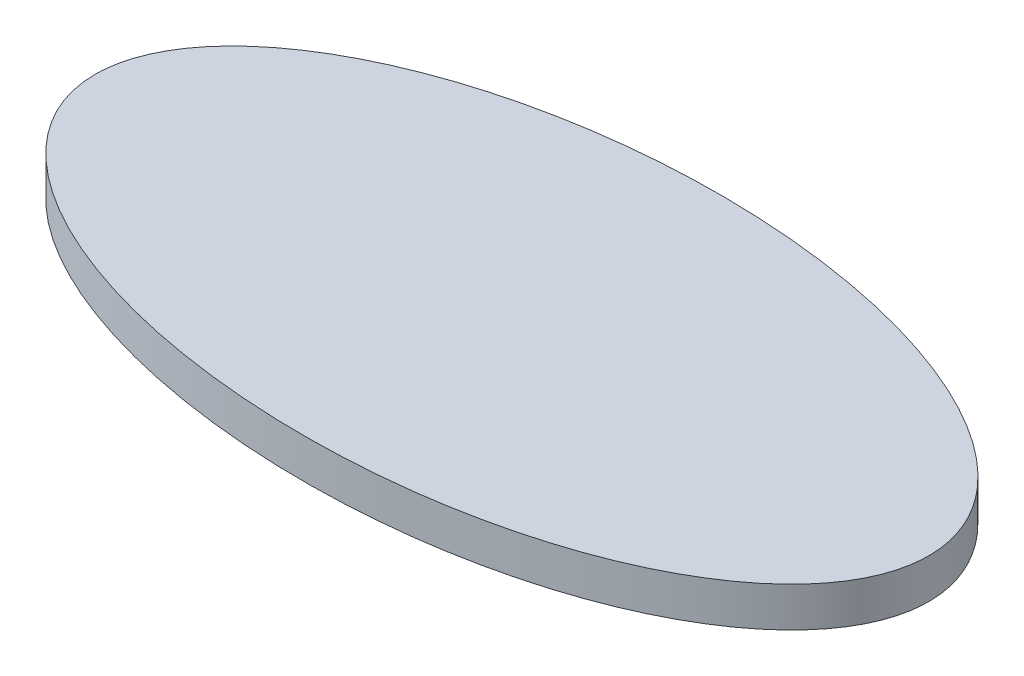
ISO-10303-21;
HEADER;
FILE_DESCRIPTION(('STEP AP214'),'2;1');
FILE_NAME('part.step','',(''),(''),'','','');
FILE_SCHEMA(('AUTOMOTIVE_DESIGN { 1 0 10303 214 1 1 1 1 }'));
ENDSEC;
DATA;
#1=APPLICATION_CONTEXT('core data for automotive mechanical design processes');
#2=APPLICATION_PROTOCOL_DEFINITION('international standard','automotive_design',2000,#1);
#3=PRODUCT_CONTEXT('',#1,'mechanical');
#4=PRODUCT('Part','Part','',(#3));
#5=PRODUCT_RELATED_PRODUCT_CATEGORY('part','',(#4));
#6=PRODUCT_DEFINITION_FORMATION('','',#4);
#7=PRODUCT_DEFINITION_CONTEXT('part definition',#1,'design');
#8=PRODUCT_DEFINITION('design','',#6,#7);
#9=PRODUCT_DEFINITION_SHAPE('','',#8);
#10=(LENGTH_UNIT() NAMED_UNIT(*) SI_UNIT(.MILLI.,.METRE.));
#11=(NAMED_UNIT(*) PLANE_ANGLE_UNIT() SI_UNIT($,.RADIAN.));
#12=(NAMED_UNIT(*) SI_UNIT($,.STERADIAN.) SOLID_ANGLE_UNIT());
#13=UNCERTAINTY_MEASURE_WITH_UNIT(LENGTH_MEASURE(1.E-05),#10,'distance_accuracy_value','');
#14=(GEOMETRIC_REPRESENTATION_CONTEXT(3) GLOBAL_UNCERTAINTY_ASSIGNED_CONTEXT((#13)) GLOBAL_UNIT_ASSIGNED_CONTEXT((#10,
#11,#12)) REPRESENTATION_CONTEXT('',''));
#15=CARTESIAN_POINT('',(0.,0.,0.));
#16=DIRECTION('',(0.,0.,1.));
#17=DIRECTION('',(1.,0.,0.));
#18=AXIS2_PLACEMENT_3D('',#15,#16,#17);
#19=CARTESIAN_POINT('',(0.,233.131797749979,0.));
#20=DIRECTION('',(0.,1.,0.));
#21=DIRECTION('',(-1.,0.,0.));
#22=AXIS2_PLACEMENT_3D('',#19,#20,#21);
#23=ELLIPSE('',#22,100.,50.);
#24=DIRECTION('',(0.,-1.,0.));
#25=VECTOR('',#24,1.);
#26=SURFACE_OF_LINEAR_EXTRUSION('',#23,#25);
#27=CARTESIAN_POINT('',(0.,0.,0.));
#28=DIRECTION('',(0.,1.,0.));
#29=DIRECTION('',(-1.,0.,0.));
#30=AXIS2_PLACEMENT_3D('',#27,#28,#29);
#31=ELLIPSE('',#30,100.,50.);
#32=CARTESIAN_POINT('',(-100.,0.,0.));
#33=VERTEX_POINT('',#32);
#34=EDGE_CURVE('E39',#33,#33,#31,.T.);
#35=ORIENTED_EDGE('',*,*,#34,.T.);
#36=EDGE_LOOP('',(#35));
#37=FACE_BOUND('',#36,.T.);
#38=CARTESIAN_POINT('',(0.,9.52500000000001,0.));
#39=DIRECTION('',(0.,1.,0.));
#40=DIRECTION('',(-1.,0.,0.));
#41=AXIS2_PLACEMENT_3D('',#38,#39,#40);
#42=ELLIPSE('',#41,100.,50.);
#43=CARTESIAN_POINT('',(-100.,9.52500000000001,0.));
#44=VERTEX_POINT('',#43);
#45=EDGE_CURVE('E10',#44,#44,#42,.T.);
#46=ORIENTED_EDGE('',*,*,#45,.F.);
#47=EDGE_LOOP('',(#46));
#48=FACE_BOUND('',#47,.T.);
#49=ADVANCED_FACE('F31',(#37,#48),#26,.F.);
#50=CARTESIAN_POINT('',(0.,0.,0.));
#51=DIRECTION('',(0.,1.,0.));
#52=DIRECTION('',(0.,0.,1.));
#53=AXIS2_PLACEMENT_3D('',#50,#51,#52);
#54=PLANE('',#53);
#55=ORIENTED_EDGE('',*,*,#34,.F.);
#56=EDGE_LOOP('',(#55));
#57=FACE_BOUND('',#56,.T.);
#58=ADVANCED_FACE('F48',(#57),#54,.F.);
#59=CARTESIAN_POINT('',(0.,9.525,0.));
#60=DIRECTION('',(0.,1.,0.));
#61=DIRECTION('',(0.,0.,1.));
#62=AXIS2_PLACEMENT_3D('',#59,#60,#61);
#63=PLANE('',#62);
#64=ORIENTED_EDGE('',*,*,#45,.T.);
#65=EDGE_LOOP('',(#64));
#66=FACE_BOUND('',#65,.T.);
#67=ADVANCED_FACE('F33',(#66),#63,.T.);
#68=CLOSED_SHELL('',(#49,#58,#67));
#69=MANIFOLD_SOLID_BREP('B2',#68);
#70=ADVANCED_BREP_SHAPE_REPRESENTATION('',(#18,#69),#14);
#71=SHAPE_DEFINITION_REPRESENTATION(#9,#70);
ENDSEC;
END-ISO-10303-21;
